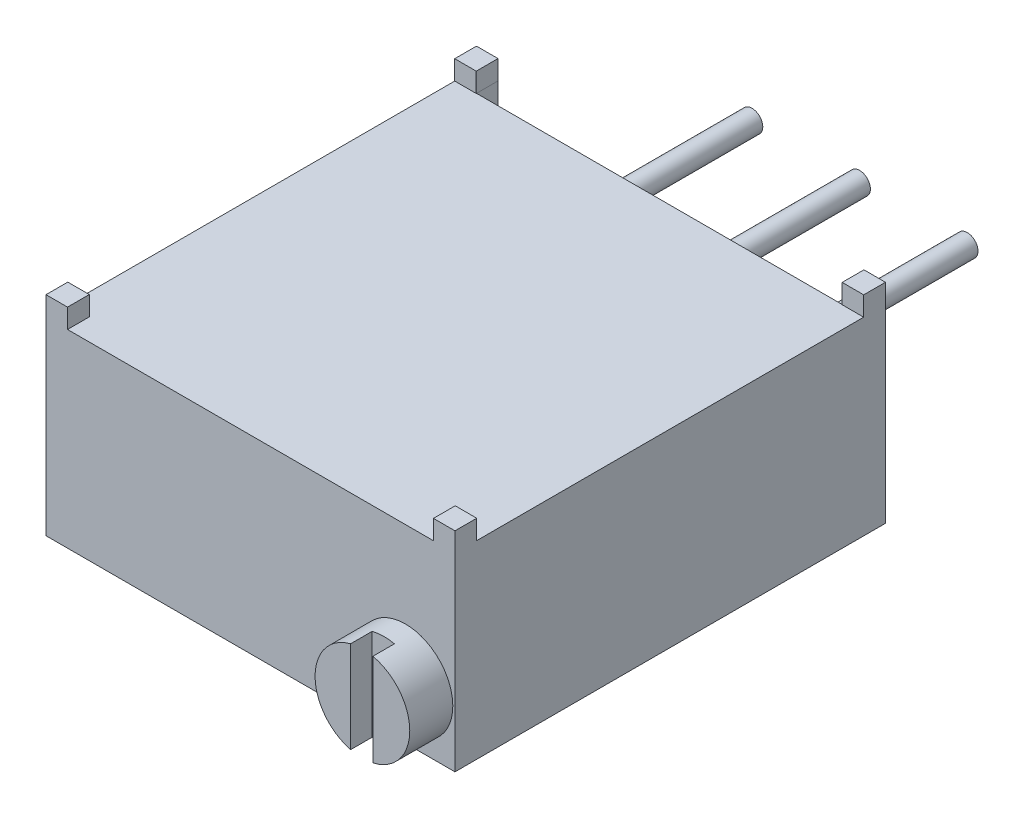
ISO-10303-21;
HEADER;
FILE_DESCRIPTION(('STEP AP214'),'2;1');
FILE_NAME('part.step','',(''),(''),'','','');
FILE_SCHEMA(('AUTOMOTIVE_DESIGN { 1 0 10303 214 1 1 1 1 }'));
ENDSEC;
DATA;
#1=APPLICATION_CONTEXT('core data for automotive mechanical design processes');
#2=APPLICATION_PROTOCOL_DEFINITION('international standard','automotive_design',2000,#1);
#3=PRODUCT_CONTEXT('',#1,'mechanical');
#4=PRODUCT('Part','Part','',(#3));
#5=PRODUCT_RELATED_PRODUCT_CATEGORY('part','',(#4));
#6=PRODUCT_DEFINITION_FORMATION('','',#4);
#7=PRODUCT_DEFINITION_CONTEXT('part definition',#1,'design');
#8=PRODUCT_DEFINITION('design','',#6,#7);
#9=PRODUCT_DEFINITION_SHAPE('','',#8);
#10=(LENGTH_UNIT() NAMED_UNIT(*) SI_UNIT(.MILLI.,.METRE.));
#11=(NAMED_UNIT(*) PLANE_ANGLE_UNIT() SI_UNIT($,.RADIAN.));
#12=(NAMED_UNIT(*) SI_UNIT($,.STERADIAN.) SOLID_ANGLE_UNIT());
#13=UNCERTAINTY_MEASURE_WITH_UNIT(LENGTH_MEASURE(1.E-05),#10,'distance_accuracy_value','');
#14=(GEOMETRIC_REPRESENTATION_CONTEXT(3) GLOBAL_UNCERTAINTY_ASSIGNED_CONTEXT((#13)) GLOBAL_UNIT_ASSIGNED_CONTEXT((#10,
#11,#12)) REPRESENTATION_CONTEXT('',''));
#15=CARTESIAN_POINT('',(0.,0.,0.));
#16=DIRECTION('',(0.,0.,1.));
#17=DIRECTION('',(1.,0.,0.));
#18=AXIS2_PLACEMENT_3D('',#15,#16,#17);
#19=CARTESIAN_POINT('',(-4.75,2.425,0.));
#20=DIRECTION('',(0.,1.,0.));
#21=DIRECTION('',(1.,0.,0.));
#22=AXIS2_PLACEMENT_3D('',#19,#20,#21);
#23=PLANE('',#22);
#24=DIRECTION('',(0.,0.,1.));
#25=VECTOR('',#24,1.);
#26=CARTESIAN_POINT('',(4.25,2.425,0.));
#27=LINE('',#26,#25);
#28=CARTESIAN_POINT('',(4.25,2.425,0.));
#29=VERTEX_POINT('',#28);
#30=CARTESIAN_POINT('',(4.25,2.425,0.5));
#31=VERTEX_POINT('',#30);
#32=EDGE_CURVE('P0_E11',#29,#31,#27,.T.);
#33=ORIENTED_EDGE('',*,*,#32,.T.);
#34=DIRECTION('',(0.,0.,-1.));
#35=VECTOR('',#34,1.);
#36=CARTESIAN_POINT('',(4.25,2.425,0.505806));
#37=LINE('',#36,#35);
#38=CARTESIAN_POINT('',(4.25,2.425,0.505806));
#39=VERTEX_POINT('',#38);
#40=EDGE_CURVE('P0_E28',#39,#31,#37,.T.);
#41=ORIENTED_EDGE('',*,*,#40,.F.);
#42=DIRECTION('',(-1.,0.,0.));
#43=VECTOR('',#42,1.);
#44=CARTESIAN_POINT('',(5.094449999992,2.425,0.505806));
#45=LINE('',#44,#43);
#46=CARTESIAN_POINT('',(4.75,2.425,0.505806));
#47=VERTEX_POINT('',#46);
#48=EDGE_CURVE('P0_E21',#47,#39,#45,.T.);
#49=ORIENTED_EDGE('',*,*,#48,.F.);
#50=DIRECTION('',(0.,0.,1.));
#51=VECTOR('',#50,1.);
#52=CARTESIAN_POINT('',(4.75,2.425,0.));
#53=LINE('',#52,#51);
#54=CARTESIAN_POINT('',(4.75,2.425,0.));
#55=VERTEX_POINT('',#54);
#56=EDGE_CURVE('P0_E411',#55,#47,#53,.T.);
#57=ORIENTED_EDGE('',*,*,#56,.F.);
#58=DIRECTION('',(1.,0.,0.));
#59=VECTOR('',#58,1.);
#60=CARTESIAN_POINT('',(-4.75,2.425,0.));
#61=LINE('',#60,#59);
#62=EDGE_CURVE('P0_E351',#29,#55,#61,.T.);
#63=ORIENTED_EDGE('',*,*,#62,.F.);
#64=EDGE_LOOP('',(#33,#41,#49,#57,#63));
#65=FACE_BOUND('',#64,.T.);
#66=ADVANCED_FACE('P0_F17',(#65),#23,.T.);
#67=CARTESIAN_POINT('',(4.25,-2.425,0.));
#68=DIRECTION('',(-1.,0.,0.));
#69=DIRECTION('',(0.,0.,1.));
#70=AXIS2_PLACEMENT_3D('',#67,#68,#69);
#71=PLANE('',#70);
#72=DIRECTION('',(0.,1.,0.));
#73=VECTOR('',#72,1.);
#74=CARTESIAN_POINT('',(4.25,-2.425,0.));
#75=LINE('',#74,#73);
#76=CARTESIAN_POINT('',(4.25,1.975,0.));
#77=VERTEX_POINT('',#76);
#78=EDGE_CURVE('P0_E314',#77,#29,#75,.T.);
#79=ORIENTED_EDGE('',*,*,#78,.F.);
#80=DIRECTION('',(0.,0.,-1.));
#81=VECTOR('',#80,1.);
#82=CARTESIAN_POINT('',(4.25,1.975,0.505806));
#83=LINE('',#82,#81);
#84=CARTESIAN_POINT('',(4.25,1.975,0.5));
#85=VERTEX_POINT('',#84);
#86=EDGE_CURVE('P0_E400',#85,#77,#83,.T.);
#87=ORIENTED_EDGE('',*,*,#86,.F.);
#88=DIRECTION('',(0.,1.,0.));
#89=VECTOR('',#88,1.);
#90=CARTESIAN_POINT('',(4.25,-2.425,0.5));
#91=LINE('',#90,#89);
#92=EDGE_CURVE('P0_E358',#85,#31,#91,.T.);
#93=ORIENTED_EDGE('',*,*,#92,.T.);
#94=ORIENTED_EDGE('',*,*,#32,.F.);
#95=EDGE_LOOP('',(#79,#87,#93,#94));
#96=FACE_BOUND('',#95,.T.);
#97=ADVANCED_FACE('P0_F686',(#96),#71,.T.);
#98=CARTESIAN_POINT('',(-4.75,2.425,0.));
#99=DIRECTION('',(0.,1.,0.));
#100=DIRECTION('',(1.,0.,0.));
#101=AXIS2_PLACEMENT_3D('',#98,#99,#100);
#102=PLANE('',#101);
#103=DIRECTION('',(0.,0.,-1.));
#104=VECTOR('',#103,1.);
#105=CARTESIAN_POINT('',(4.25,2.425,10.));
#106=LINE('',#105,#104);
#107=CARTESIAN_POINT('',(4.25,2.425,10.));
#108=VERTEX_POINT('',#107);
#109=CARTESIAN_POINT('',(4.25,2.425,9.494194));
#110=VERTEX_POINT('',#109);
#111=EDGE_CURVE('P0_E304',#108,#110,#106,.T.);
#112=ORIENTED_EDGE('',*,*,#111,.F.);
#113=DIRECTION('',(1.,0.,0.));
#114=VECTOR('',#113,1.);
#115=CARTESIAN_POINT('',(-4.75,2.425,10.));
#116=LINE('',#115,#114);
#117=CARTESIAN_POINT('',(4.75,2.425,10.));
#118=VERTEX_POINT('',#117);
#119=EDGE_CURVE('P0_E271',#108,#118,#116,.T.);
#120=ORIENTED_EDGE('',*,*,#119,.T.);
#121=DIRECTION('',(0.,0.,1.));
#122=VECTOR('',#121,1.);
#123=CARTESIAN_POINT('',(4.75,2.425,0.));
#124=LINE('',#123,#122);
#125=CARTESIAN_POINT('',(4.75,2.425,9.494194));
#126=VERTEX_POINT('',#125);
#127=EDGE_CURVE('P0_E308',#126,#118,#124,.T.);
#128=ORIENTED_EDGE('',*,*,#127,.F.);
#129=DIRECTION('',(1.,0.,0.));
#130=VECTOR('',#129,1.);
#131=CARTESIAN_POINT('',(4.25,2.425,9.494194));
#132=LINE('',#131,#130);
#133=EDGE_CURVE('P0_E363',#110,#126,#132,.T.);
#134=ORIENTED_EDGE('',*,*,#133,.F.);
#135=EDGE_LOOP('',(#112,#120,#128,#134));
#136=FACE_BOUND('',#135,.T.);
#137=ADVANCED_FACE('P0_F691',(#136),#102,.T.);
#138=CARTESIAN_POINT('',(-4.25,2.425,10.));
#139=DIRECTION('',(1.,0.,0.));
#140=DIRECTION('',(0.,1.,0.));
#141=AXIS2_PLACEMENT_3D('',#138,#139,#140);
#142=PLANE('',#141);
#143=DIRECTION('',(0.,-1.,0.));
#144=VECTOR('',#143,1.);
#145=CARTESIAN_POINT('',(-4.25,2.425,10.));
#146=LINE('',#145,#144);
#147=CARTESIAN_POINT('',(-4.25,2.425,10.));
#148=VERTEX_POINT('',#147);
#149=CARTESIAN_POINT('',(-4.25,1.975,10.));
#150=VERTEX_POINT('',#149);
#151=EDGE_CURVE('P0_E212',#148,#150,#146,.T.);
#152=ORIENTED_EDGE('',*,*,#151,.T.);
#153=DIRECTION('',(0.,0.,-1.));
#154=VECTOR('',#153,1.);
#155=CARTESIAN_POINT('',(-4.25,1.975,10.));
#156=LINE('',#155,#154);
#157=CARTESIAN_POINT('',(-4.25,1.975,9.494194));
#158=VERTEX_POINT('',#157);
#159=EDGE_CURVE('P0_E210',#150,#158,#156,.T.);
#160=ORIENTED_EDGE('',*,*,#159,.T.);
#161=DIRECTION('',(0.,-1.,0.));
#162=VECTOR('',#161,1.);
#163=CARTESIAN_POINT('',(-4.25,2.425,9.494194));
#164=LINE('',#163,#162);
#165=CARTESIAN_POINT('',(-4.25,2.425,9.494194));
#166=VERTEX_POINT('',#165);
#167=EDGE_CURVE('P0_E196',#166,#158,#164,.T.);
#168=ORIENTED_EDGE('',*,*,#167,.F.);
#169=DIRECTION('',(0.,0.,-1.));
#170=VECTOR('',#169,1.);
#171=CARTESIAN_POINT('',(-4.25,2.425,10.));
#172=LINE('',#171,#170);
#173=EDGE_CURVE('P0_E266',#148,#166,#172,.T.);
#174=ORIENTED_EDGE('',*,*,#173,.F.);
#175=EDGE_LOOP('',(#152,#160,#168,#174));
#176=FACE_BOUND('',#175,.T.);
#177=ADVANCED_FACE('P0_F211',(#176),#142,.T.);
#178=CARTESIAN_POINT('',(4.25,2.425,0.505806));
#179=DIRECTION('',(1.,0.,0.));
#180=DIRECTION('',(0.,1.,0.));
#181=AXIS2_PLACEMENT_3D('',#178,#179,#180);
#182=PLANE('',#181);
#183=ORIENTED_EDGE('',*,*,#92,.F.);
#184=DIRECTION('',(0.,0.,-1.));
#185=VECTOR('',#184,1.);
#186=CARTESIAN_POINT('',(4.25,1.975,0.505806));
#187=LINE('',#186,#185);
#188=CARTESIAN_POINT('',(4.25,1.975,0.505806));
#189=VERTEX_POINT('',#188);
#190=EDGE_CURVE('P0_E232',#189,#85,#187,.T.);
#191=ORIENTED_EDGE('',*,*,#190,.F.);
#192=DIRECTION('',(0.,-1.,0.));
#193=VECTOR('',#192,1.);
#194=CARTESIAN_POINT('',(4.25,2.425,0.505806));
#195=LINE('',#194,#193);
#196=EDGE_CURVE('P0_E367',#39,#189,#195,.T.);
#197=ORIENTED_EDGE('',*,*,#196,.F.);
#198=ORIENTED_EDGE('',*,*,#40,.T.);
#199=EDGE_LOOP('',(#183,#191,#197,#198));
#200=FACE_BOUND('',#199,.T.);
#201=ADVANCED_FACE('P0_F670',(#200),#182,.F.);
#202=CARTESIAN_POINT('',(5.094449999992,2.425,0.505806));
#203=DIRECTION('',(0.,0.,-1.));
#204=DIRECTION('',(0.,-1.,0.));
#205=AXIS2_PLACEMENT_3D('',#202,#203,#204);
#206=PLANE('',#205);
#207=ORIENTED_EDGE('',*,*,#196,.T.);
#208=DIRECTION('',(-1.,0.,0.));
#209=VECTOR('',#208,1.);
#210=CARTESIAN_POINT('',(5.094449999992,1.975,0.505806));
#211=LINE('',#210,#209);
#212=CARTESIAN_POINT('',(4.75,1.975,0.505806));
#213=VERTEX_POINT('',#212);
#214=EDGE_CURVE('P0_E237',#213,#189,#211,.T.);
#215=ORIENTED_EDGE('',*,*,#214,.F.);
#216=DIRECTION('',(0.,1.,0.));
#217=VECTOR('',#216,1.);
#218=CARTESIAN_POINT('',(4.75,2.425,0.505806));
#219=LINE('',#218,#217);
#220=EDGE_CURVE('P0_E415',#213,#47,#219,.T.);
#221=ORIENTED_EDGE('',*,*,#220,.T.);
#222=ORIENTED_EDGE('',*,*,#48,.T.);
#223=EDGE_LOOP('',(#207,#215,#221,#222));
#224=FACE_BOUND('',#223,.T.);
#225=ADVANCED_FACE('P0_F624',(#224),#206,.F.);
#226=CARTESIAN_POINT('',(4.25,2.425,9.494194));
#227=DIRECTION('',(0.,0.,1.));
#228=DIRECTION('',(0.,-1.,0.));
#229=AXIS2_PLACEMENT_3D('',#226,#227,#228);
#230=PLANE('',#229);
#231=DIRECTION('',(0.,-1.,0.));
#232=VECTOR('',#231,1.);
#233=CARTESIAN_POINT('',(4.75,2.425,9.494194));
#234=LINE('',#233,#232);
#235=CARTESIAN_POINT('',(4.75,1.975,9.494194));
#236=VERTEX_POINT('',#235);
#237=EDGE_CURVE('P0_E235',#126,#236,#234,.T.);
#238=ORIENTED_EDGE('',*,*,#237,.T.);
#239=DIRECTION('',(1.,0.,0.));
#240=VECTOR('',#239,1.);
#241=CARTESIAN_POINT('',(4.25,1.975,9.494194));
#242=LINE('',#241,#240);
#243=CARTESIAN_POINT('',(4.25,1.975,9.494194));
#244=VERTEX_POINT('',#243);
#245=EDGE_CURVE('P0_E249',#244,#236,#242,.T.);
#246=ORIENTED_EDGE('',*,*,#245,.F.);
#247=DIRECTION('',(0.,-1.,0.));
#248=VECTOR('',#247,1.);
#249=CARTESIAN_POINT('',(4.25,2.425,9.494194));
#250=LINE('',#249,#248);
#251=EDGE_CURVE('P0_E307',#110,#244,#250,.T.);
#252=ORIENTED_EDGE('',*,*,#251,.F.);
#253=ORIENTED_EDGE('',*,*,#133,.T.);
#254=EDGE_LOOP('',(#238,#246,#252,#253));
#255=FACE_BOUND('',#254,.T.);
#256=ADVANCED_FACE('P0_F618',(#255),#230,.F.);
#257=CARTESIAN_POINT('',(4.25,2.425,10.));
#258=DIRECTION('',(1.,0.,0.));
#259=DIRECTION('',(0.,1.,0.));
#260=AXIS2_PLACEMENT_3D('',#257,#258,#259);
#261=PLANE('',#260);
#262=ORIENTED_EDGE('',*,*,#111,.T.);
#263=ORIENTED_EDGE('',*,*,#251,.T.);
#264=DIRECTION('',(0.,0.,-1.));
#265=VECTOR('',#264,1.);
#266=CARTESIAN_POINT('',(4.25,1.975,10.));
#267=LINE('',#266,#265);
#268=CARTESIAN_POINT('',(4.25,1.975,10.));
#269=VERTEX_POINT('',#268);
#270=EDGE_CURVE('P0_E294',#269,#244,#267,.T.);
#271=ORIENTED_EDGE('',*,*,#270,.F.);
#272=DIRECTION('',(0.,-1.,0.));
#273=VECTOR('',#272,1.);
#274=CARTESIAN_POINT('',(4.25,2.425,10.));
#275=LINE('',#274,#273);
#276=EDGE_CURVE('P0_E280',#108,#269,#275,.T.);
#277=ORIENTED_EDGE('',*,*,#276,.F.);
#278=EDGE_LOOP('',(#262,#263,#271,#277));
#279=FACE_BOUND('',#278,.T.);
#280=ADVANCED_FACE('P0_F623',(#279),#261,.F.);
#281=CARTESIAN_POINT('',(4.75,2.425,0.));
#282=DIRECTION('',(1.,0.,0.));
#283=DIRECTION('',(0.,1.,0.));
#284=AXIS2_PLACEMENT_3D('',#281,#282,#283);
#285=PLANE('',#284);
#286=DIRECTION('',(0.,-1.,0.));
#287=VECTOR('',#286,1.);
#288=CARTESIAN_POINT('',(4.75,2.425,0.));
#289=LINE('',#288,#287);
#290=CARTESIAN_POINT('',(4.75,-2.425,0.));
#291=VERTEX_POINT('',#290);
#292=EDGE_CURVE('P0_E384',#55,#291,#289,.T.);
#293=ORIENTED_EDGE('',*,*,#292,.F.);
#294=ORIENTED_EDGE('',*,*,#56,.T.);
#295=ORIENTED_EDGE('',*,*,#220,.F.);
#296=DIRECTION('',(0.,0.,-1.));
#297=VECTOR('',#296,1.);
#298=CARTESIAN_POINT('',(4.75,1.975,2.5));
#299=LINE('',#298,#297);
#300=EDGE_CURVE('P0_E240',#236,#213,#299,.T.);
#301=ORIENTED_EDGE('',*,*,#300,.F.);
#302=ORIENTED_EDGE('',*,*,#237,.F.);
#303=ORIENTED_EDGE('',*,*,#127,.T.);
#304=DIRECTION('',(0.,-1.,0.));
#305=VECTOR('',#304,1.);
#306=CARTESIAN_POINT('',(4.75,2.425,10.));
#307=LINE('',#306,#305);
#308=CARTESIAN_POINT('',(4.75,-2.425,10.));
#309=VERTEX_POINT('',#308);
#310=EDGE_CURVE('P0_E269',#118,#309,#307,.T.);
#311=ORIENTED_EDGE('',*,*,#310,.T.);
#312=DIRECTION('',(0.,0.,1.));
#313=VECTOR('',#312,1.);
#314=CARTESIAN_POINT('',(4.75,-2.425,0.));
#315=LINE('',#314,#313);
#316=EDGE_CURVE('P0_E372',#291,#309,#315,.T.);
#317=ORIENTED_EDGE('',*,*,#316,.F.);
#318=EDGE_LOOP('',(#293,#294,#295,#301,#302,#303,#311,#317));
#319=FACE_BOUND('',#318,.T.);
#320=ADVANCED_FACE('P0_F762',(#319),#285,.T.);
#321=CARTESIAN_POINT('',(0.,0.,0.5));
#322=DIRECTION('',(0.,0.,1.));
#323=DIRECTION('',(1.,0.,0.));
#324=AXIS2_PLACEMENT_3D('',#321,#322,#323);
#325=PLANE('',#324);
#326=DIRECTION('',(1.,0.,0.));
#327=VECTOR('',#326,1.);
#328=CARTESIAN_POINT('',(0.,1.975,0.5));
#329=LINE('',#328,#327);
#330=CARTESIAN_POINT('',(-4.25,1.975,0.5));
#331=VERTEX_POINT('',#330);
#332=EDGE_CURVE('P0_E225',#331,#85,#329,.T.);
#333=ORIENTED_EDGE('',*,*,#332,.T.);
#334=DIRECTION('',(0.,1.,0.));
#335=VECTOR('',#334,1.);
#336=CARTESIAN_POINT('',(4.25,-2.425,0.5));
#337=LINE('',#336,#335);
#338=CARTESIAN_POINT('',(4.25,-2.425,0.5));
#339=VERTEX_POINT('',#338);
#340=EDGE_CURVE('P0_E387',#339,#85,#337,.T.);
#341=ORIENTED_EDGE('',*,*,#340,.F.);
#342=DIRECTION('',(1.,0.,0.));
#343=VECTOR('',#342,1.);
#344=CARTESIAN_POINT('',(-4.25,-2.425,0.5));
#345=LINE('',#344,#343);
#346=CARTESIAN_POINT('',(-4.25,-2.425,0.5));
#347=VERTEX_POINT('',#346);
#348=EDGE_CURVE('P0_E333',#347,#339,#345,.T.);
#349=ORIENTED_EDGE('',*,*,#348,.F.);
#350=DIRECTION('',(0.,-1.,0.));
#351=VECTOR('',#350,1.);
#352=CARTESIAN_POINT('',(-4.25,2.425,0.5));
#353=LINE('',#352,#351);
#354=EDGE_CURVE('P0_E255',#331,#347,#353,.T.);
#355=ORIENTED_EDGE('',*,*,#354,.F.);
#356=EDGE_LOOP('',(#333,#341,#349,#355));
#357=FACE_BOUND('',#356,.T.);
#358=ADVANCED_FACE('P0_F19',(#357),#325,.F.);
#359=CARTESIAN_POINT('',(4.25,-2.425,0.));
#360=DIRECTION('',(-1.,0.,0.));
#361=DIRECTION('',(0.,0.,1.));
#362=AXIS2_PLACEMENT_3D('',#359,#360,#361);
#363=PLANE('',#362);
#364=DIRECTION('',(0.,1.,0.));
#365=VECTOR('',#364,1.);
#366=CARTESIAN_POINT('',(4.25,-2.425,0.));
#367=LINE('',#366,#365);
#368=CARTESIAN_POINT('',(4.25,-2.425,0.));
#369=VERTEX_POINT('',#368);
#370=EDGE_CURVE('P0_E310',#369,#77,#367,.T.);
#371=ORIENTED_EDGE('',*,*,#370,.F.);
#372=DIRECTION('',(0.,0.,1.));
#373=VECTOR('',#372,1.);
#374=CARTESIAN_POINT('',(4.25,-2.425,0.));
#375=LINE('',#374,#373);
#376=EDGE_CURVE('P0_E329',#369,#339,#375,.T.);
#377=ORIENTED_EDGE('',*,*,#376,.T.);
#378=ORIENTED_EDGE('',*,*,#340,.T.);
#379=ORIENTED_EDGE('',*,*,#86,.T.);
#380=EDGE_LOOP('',(#371,#377,#378,#379));
#381=FACE_BOUND('',#380,.T.);
#382=ADVANCED_FACE('P0_F736',(#381),#363,.T.);
#383=CARTESIAN_POINT('',(0.,0.,0.));
#384=DIRECTION('',(0.,0.,-1.));
#385=DIRECTION('',(0.,-1.,0.));
#386=AXIS2_PLACEMENT_3D('',#383,#384,#385);
#387=PLANE('',#386);
#388=ORIENTED_EDGE('',*,*,#370,.T.);
#389=ORIENTED_EDGE('',*,*,#78,.T.);
#390=ORIENTED_EDGE('',*,*,#62,.T.);
#391=ORIENTED_EDGE('',*,*,#292,.T.);
#392=DIRECTION('',(-1.,0.,0.));
#393=VECTOR('',#392,1.);
#394=CARTESIAN_POINT('',(4.75,-2.425,0.));
#395=LINE('',#394,#393);
#396=EDGE_CURVE('P0_E368',#291,#369,#395,.T.);
#397=ORIENTED_EDGE('',*,*,#396,.T.);
#398=EDGE_LOOP('',(#388,#389,#390,#391,#397));
#399=FACE_BOUND('',#398,.T.);
#400=ADVANCED_FACE('P0_F663',(#399),#387,.T.);
#401=CARTESIAN_POINT('',(0.,0.,10.));
#402=DIRECTION('',(0.,0.,-1.));
#403=DIRECTION('',(0.,-1.,0.));
#404=AXIS2_PLACEMENT_3D('',#401,#402,#403);
#405=PLANE('',#404);
#406=DIRECTION('',(-1.,0.,0.));
#407=VECTOR('',#406,1.);
#408=CARTESIAN_POINT('',(4.75,-2.425,10.));
#409=LINE('',#408,#407);
#410=CARTESIAN_POINT('',(-4.75,-2.425,10.));
#411=VERTEX_POINT('',#410);
#412=EDGE_CURVE('P0_E348',#309,#411,#409,.T.);
#413=ORIENTED_EDGE('',*,*,#412,.F.);
#414=ORIENTED_EDGE('',*,*,#310,.F.);
#415=ORIENTED_EDGE('',*,*,#119,.F.);
#416=ORIENTED_EDGE('',*,*,#276,.T.);
#417=DIRECTION('',(-1.,0.,0.));
#418=VECTOR('',#417,1.);
#419=CARTESIAN_POINT('',(4.25,1.975,10.));
#420=LINE('',#419,#418);
#421=EDGE_CURVE('P0_E217',#269,#150,#420,.T.);
#422=ORIENTED_EDGE('',*,*,#421,.T.);
#423=ORIENTED_EDGE('',*,*,#151,.F.);
#424=DIRECTION('',(1.,0.,0.));
#425=VECTOR('',#424,1.);
#426=CARTESIAN_POINT('',(-4.75,2.425,10.));
#427=LINE('',#426,#425);
#428=CARTESIAN_POINT('',(-4.75,2.425,10.));
#429=VERTEX_POINT('',#428);
#430=EDGE_CURVE('P0_E207',#429,#148,#427,.T.);
#431=ORIENTED_EDGE('',*,*,#430,.F.);
#432=DIRECTION('',(0.,1.,0.));
#433=VECTOR('',#432,1.);
#434=CARTESIAN_POINT('',(-4.75,-2.425,10.));
#435=LINE('',#434,#433);
#436=EDGE_CURVE('P0_E340',#411,#429,#435,.T.);
#437=ORIENTED_EDGE('',*,*,#436,.F.);
#438=EDGE_LOOP('',(#413,#414,#415,#416,#422,#423,#431,#437));
#439=FACE_BOUND('',#438,.T.);
#440=ADVANCED_FACE('P0_F657',(#439),#405,.F.);
#441=CARTESIAN_POINT('',(-4.75,2.425,0.));
#442=DIRECTION('',(0.,1.,0.));
#443=DIRECTION('',(1.,0.,0.));
#444=AXIS2_PLACEMENT_3D('',#441,#442,#443);
#445=PLANE('',#444);
#446=DIRECTION('',(-1.,0.,0.));
#447=VECTOR('',#446,1.);
#448=CARTESIAN_POINT('',(-4.25,2.425,9.494194));
#449=LINE('',#448,#447);
#450=CARTESIAN_POINT('',(-4.75,2.425,9.494194));
#451=VERTEX_POINT('',#450);
#452=EDGE_CURVE('P0_E203',#166,#451,#449,.T.);
#453=ORIENTED_EDGE('',*,*,#452,.T.);
#454=DIRECTION('',(0.,0.,1.));
#455=VECTOR('',#454,1.);
#456=CARTESIAN_POINT('',(-4.75,2.425,0.));
#457=LINE('',#456,#455);
#458=EDGE_CURVE('P0_E344',#451,#429,#457,.T.);
#459=ORIENTED_EDGE('',*,*,#458,.T.);
#460=ORIENTED_EDGE('',*,*,#430,.T.);
#461=ORIENTED_EDGE('',*,*,#173,.T.);
#462=EDGE_LOOP('',(#453,#459,#460,#461));
#463=FACE_BOUND('',#462,.T.);
#464=ADVANCED_FACE('P0_F662',(#463),#445,.T.);
#465=CARTESIAN_POINT('',(-4.25,2.425,9.494194));
#466=DIRECTION('',(0.,0.,-1.));
#467=DIRECTION('',(0.,-1.,0.));
#468=AXIS2_PLACEMENT_3D('',#465,#466,#467);
#469=PLANE('',#468);
#470=ORIENTED_EDGE('',*,*,#452,.F.);
#471=ORIENTED_EDGE('',*,*,#167,.T.);
#472=DIRECTION('',(-1.,0.,0.));
#473=VECTOR('',#472,1.);
#474=CARTESIAN_POINT('',(-4.25,1.975,9.494194));
#475=LINE('',#474,#473);
#476=CARTESIAN_POINT('',(-4.75,1.975,9.494194));
#477=VERTEX_POINT('',#476);
#478=EDGE_CURVE('P0_E201',#158,#477,#475,.T.);
#479=ORIENTED_EDGE('',*,*,#478,.T.);
#480=DIRECTION('',(0.,-1.,0.));
#481=VECTOR('',#480,1.);
#482=CARTESIAN_POINT('',(-4.75,0.,9.494194));
#483=LINE('',#482,#481);
#484=EDGE_CURVE('P0_E362',#451,#477,#483,.T.);
#485=ORIENTED_EDGE('',*,*,#484,.F.);
#486=EDGE_LOOP('',(#470,#471,#479,#485));
#487=FACE_BOUND('',#486,.T.);
#488=ADVANCED_FACE('P0_F198',(#487),#469,.T.);
#489=CARTESIAN_POINT('',(0.,1.975,5.));
#490=DIRECTION('',(0.,-1.,0.));
#491=DIRECTION('',(-1.,0.,0.));
#492=AXIS2_PLACEMENT_3D('',#489,#490,#491);
#493=PLANE('',#492);
#494=ORIENTED_EDGE('',*,*,#245,.T.);
#495=ORIENTED_EDGE('',*,*,#300,.T.);
#496=ORIENTED_EDGE('',*,*,#214,.T.);
#497=ORIENTED_EDGE('',*,*,#190,.T.);
#498=ORIENTED_EDGE('',*,*,#332,.F.);
#499=DIRECTION('',(0.,0.,-1.));
#500=VECTOR('',#499,1.);
#501=CARTESIAN_POINT('',(-4.25,1.975,0.505806));
#502=LINE('',#501,#500);
#503=CARTESIAN_POINT('',(-4.25,1.975,0.505806));
#504=VERTEX_POINT('',#503);
#505=EDGE_CURVE('P0_E260',#504,#331,#502,.T.);
#506=ORIENTED_EDGE('',*,*,#505,.F.);
#507=DIRECTION('',(1.,0.,0.));
#508=VECTOR('',#507,1.);
#509=CARTESIAN_POINT('',(-5.094449999992,1.975,0.505806));
#510=LINE('',#509,#508);
#511=CARTESIAN_POINT('',(-4.75,1.975,0.505806));
#512=VERTEX_POINT('',#511);
#513=EDGE_CURVE('P0_E328',#512,#504,#510,.T.);
#514=ORIENTED_EDGE('',*,*,#513,.F.);
#515=DIRECTION('',(0.,0.,1.));
#516=VECTOR('',#515,1.);
#517=CARTESIAN_POINT('',(-4.75,1.975,2.5));
#518=LINE('',#517,#516);
#519=EDGE_CURVE('P0_E222',#512,#477,#518,.T.);
#520=ORIENTED_EDGE('',*,*,#519,.T.);
#521=ORIENTED_EDGE('',*,*,#478,.F.);
#522=ORIENTED_EDGE('',*,*,#159,.F.);
#523=ORIENTED_EDGE('',*,*,#421,.F.);
#524=ORIENTED_EDGE('',*,*,#270,.T.);
#525=EDGE_LOOP('',(#494,#495,#496,#497,#498,#506,#514,#520,#521,#522,#523,#524));
#526=FACE_BOUND('',#525,.T.);
#527=ADVANCED_FACE('P0_F220',(#526),#493,.F.);
#528=CARTESIAN_POINT('',(-4.25,2.425,0.));
#529=DIRECTION('',(1.,0.,0.));
#530=DIRECTION('',(0.,1.,0.));
#531=AXIS2_PLACEMENT_3D('',#528,#529,#530);
#532=PLANE('',#531);
#533=DIRECTION('',(0.,-1.,0.));
#534=VECTOR('',#533,1.);
#535=CARTESIAN_POINT('',(-4.25,2.425,0.));
#536=LINE('',#535,#534);
#537=CARTESIAN_POINT('',(-4.25,1.975,0.));
#538=VERTEX_POINT('',#537);
#539=CARTESIAN_POINT('',(-4.25,-2.425,0.));
#540=VERTEX_POINT('',#539);
#541=EDGE_CURVE('P0_E380',#538,#540,#536,.T.);
#542=ORIENTED_EDGE('',*,*,#541,.F.);
#543=DIRECTION('',(0.,0.,-1.));
#544=VECTOR('',#543,1.);
#545=CARTESIAN_POINT('',(-4.25,1.975,0.505806));
#546=LINE('',#545,#544);
#547=EDGE_CURVE('P0_E142',#331,#538,#546,.T.);
#548=ORIENTED_EDGE('',*,*,#547,.F.);
#549=ORIENTED_EDGE('',*,*,#354,.T.);
#550=DIRECTION('',(0.,0.,1.));
#551=VECTOR('',#550,1.);
#552=CARTESIAN_POINT('',(-4.25,-2.425,0.));
#553=LINE('',#552,#551);
#554=EDGE_CURVE('P0_E130',#540,#347,#553,.T.);
#555=ORIENTED_EDGE('',*,*,#554,.F.);
#556=EDGE_LOOP('',(#542,#548,#549,#555));
#557=FACE_BOUND('',#556,.T.);
#558=ADVANCED_FACE('P0_F462',(#557),#532,.T.);
#559=CARTESIAN_POINT('',(4.75,-2.425,0.));
#560=DIRECTION('',(0.,-1.,0.));
#561=DIRECTION('',(0.,0.,-1.));
#562=AXIS2_PLACEMENT_3D('',#559,#560,#561);
#563=PLANE('',#562);
#564=ORIENTED_EDGE('',*,*,#396,.F.);
#565=ORIENTED_EDGE('',*,*,#316,.T.);
#566=ORIENTED_EDGE('',*,*,#412,.T.);
#567=DIRECTION('',(0.,0.,1.));
#568=VECTOR('',#567,1.);
#569=CARTESIAN_POINT('',(-4.75,-2.425,0.));
#570=LINE('',#569,#568);
#571=CARTESIAN_POINT('',(-4.75,-2.425,0.));
#572=VERTEX_POINT('',#571);
#573=EDGE_CURVE('P0_E345',#572,#411,#570,.T.);
#574=ORIENTED_EDGE('',*,*,#573,.F.);
#575=DIRECTION('',(-1.,0.,0.));
#576=VECTOR('',#575,1.);
#577=CARTESIAN_POINT('',(4.75,-2.425,0.));
#578=LINE('',#577,#576);
#579=EDGE_CURVE('P0_E374',#540,#572,#578,.T.);
#580=ORIENTED_EDGE('',*,*,#579,.F.);
#581=ORIENTED_EDGE('',*,*,#554,.T.);
#582=ORIENTED_EDGE('',*,*,#348,.T.);
#583=ORIENTED_EDGE('',*,*,#376,.F.);
#584=EDGE_LOOP('',(#564,#565,#566,#574,#580,#581,#582,#583));
#585=FACE_BOUND('',#584,.T.);
#586=ADVANCED_FACE('P0_F459',(#585),#563,.T.);
#587=CARTESIAN_POINT('',(-4.75,-2.425,0.));
#588=DIRECTION('',(-1.,0.,0.));
#589=DIRECTION('',(0.,0.,1.));
#590=AXIS2_PLACEMENT_3D('',#587,#588,#589);
#591=PLANE('',#590);
#592=DIRECTION('',(0.,1.,0.));
#593=VECTOR('',#592,1.);
#594=CARTESIAN_POINT('',(-4.75,-2.425,0.));
#595=LINE('',#594,#593);
#596=CARTESIAN_POINT('',(-4.75,2.425,0.));
#597=VERTEX_POINT('',#596);
#598=EDGE_CURVE('P0_E381',#572,#597,#595,.T.);
#599=ORIENTED_EDGE('',*,*,#598,.F.);
#600=ORIENTED_EDGE('',*,*,#573,.T.);
#601=ORIENTED_EDGE('',*,*,#436,.T.);
#602=ORIENTED_EDGE('',*,*,#458,.F.);
#603=ORIENTED_EDGE('',*,*,#484,.T.);
#604=ORIENTED_EDGE('',*,*,#519,.F.);
#605=DIRECTION('',(0.,1.,0.));
#606=VECTOR('',#605,1.);
#607=CARTESIAN_POINT('',(-4.75,0.,0.505806));
#608=LINE('',#607,#606);
#609=CARTESIAN_POINT('',(-4.75,2.425,0.505806));
#610=VERTEX_POINT('',#609);
#611=EDGE_CURVE('P0_E264',#512,#610,#608,.T.);
#612=ORIENTED_EDGE('',*,*,#611,.T.);
#613=DIRECTION('',(0.,0.,1.));
#614=VECTOR('',#613,1.);
#615=CARTESIAN_POINT('',(-4.75,2.425,0.));
#616=LINE('',#615,#614);
#617=EDGE_CURVE('P0_E299',#597,#610,#616,.T.);
#618=ORIENTED_EDGE('',*,*,#617,.F.);
#619=EDGE_LOOP('',(#599,#600,#601,#602,#603,#604,#612,#618));
#620=FACE_BOUND('',#619,.T.);
#621=ADVANCED_FACE('P0_F456',(#620),#591,.T.);
#622=CARTESIAN_POINT('',(-5.094449999992,2.425,0.505806));
#623=DIRECTION('',(0.,0.,1.));
#624=DIRECTION('',(0.,-1.,0.));
#625=AXIS2_PLACEMENT_3D('',#622,#623,#624);
#626=PLANE('',#625);
#627=DIRECTION('',(1.,0.,0.));
#628=VECTOR('',#627,1.);
#629=CARTESIAN_POINT('',(-5.094449999992,2.425,0.505806));
#630=LINE('',#629,#628);
#631=CARTESIAN_POINT('',(-4.25,2.425,0.505806));
#632=VERTEX_POINT('',#631);
#633=EDGE_CURVE('P0_E295',#610,#632,#630,.T.);
#634=ORIENTED_EDGE('',*,*,#633,.F.);
#635=ORIENTED_EDGE('',*,*,#611,.F.);
#636=ORIENTED_EDGE('',*,*,#513,.T.);
#637=DIRECTION('',(0.,-1.,0.));
#638=VECTOR('',#637,1.);
#639=CARTESIAN_POINT('',(-4.25,2.425,0.505806));
#640=LINE('',#639,#638);
#641=EDGE_CURVE('P0_E265',#632,#504,#640,.T.);
#642=ORIENTED_EDGE('',*,*,#641,.F.);
#643=EDGE_LOOP('',(#634,#635,#636,#642));
#644=FACE_BOUND('',#643,.T.);
#645=ADVANCED_FACE('P0_F612',(#644),#626,.T.);
#646=CARTESIAN_POINT('',(-4.25,2.425,0.505806));
#647=DIRECTION('',(1.,0.,0.));
#648=DIRECTION('',(0.,1.,0.));
#649=AXIS2_PLACEMENT_3D('',#646,#647,#648);
#650=PLANE('',#649);
#651=DIRECTION('',(0.,0.,-1.));
#652=VECTOR('',#651,1.);
#653=CARTESIAN_POINT('',(-4.25,2.425,0.505806));
#654=LINE('',#653,#652);
#655=CARTESIAN_POINT('',(-4.25,2.425,0.5));
#656=VERTEX_POINT('',#655);
#657=EDGE_CURVE('P0_E298',#632,#656,#654,.T.);
#658=ORIENTED_EDGE('',*,*,#657,.F.);
#659=ORIENTED_EDGE('',*,*,#641,.T.);
#660=ORIENTED_EDGE('',*,*,#505,.T.);
#661=DIRECTION('',(0.,-1.,0.));
#662=VECTOR('',#661,1.);
#663=CARTESIAN_POINT('',(-4.25,2.425,0.5));
#664=LINE('',#663,#662);
#665=EDGE_CURVE('P0_E339',#656,#331,#664,.T.);
#666=ORIENTED_EDGE('',*,*,#665,.F.);
#667=EDGE_LOOP('',(#658,#659,#660,#666));
#668=FACE_BOUND('',#667,.T.);
#669=ADVANCED_FACE('P0_F469',(#668),#650,.T.);
#670=CARTESIAN_POINT('',(-4.25,2.425,0.));
#671=DIRECTION('',(1.,0.,0.));
#672=DIRECTION('',(0.,1.,0.));
#673=AXIS2_PLACEMENT_3D('',#670,#671,#672);
#674=PLANE('',#673);
#675=DIRECTION('',(0.,-1.,0.));
#676=VECTOR('',#675,1.);
#677=CARTESIAN_POINT('',(-4.25,2.425,0.));
#678=LINE('',#677,#676);
#679=CARTESIAN_POINT('',(-4.25,2.425,0.));
#680=VERTEX_POINT('',#679);
#681=EDGE_CURVE('P0_E376',#680,#538,#678,.T.);
#682=ORIENTED_EDGE('',*,*,#681,.F.);
#683=DIRECTION('',(0.,0.,1.));
#684=VECTOR('',#683,1.);
#685=CARTESIAN_POINT('',(-4.25,2.425,0.));
#686=LINE('',#685,#684);
#687=EDGE_CURVE('P0_E318',#680,#656,#686,.T.);
#688=ORIENTED_EDGE('',*,*,#687,.T.);
#689=ORIENTED_EDGE('',*,*,#665,.T.);
#690=ORIENTED_EDGE('',*,*,#547,.T.);
#691=EDGE_LOOP('',(#682,#688,#689,#690));
#692=FACE_BOUND('',#691,.T.);
#693=ADVANCED_FACE('P0_F465',(#692),#674,.T.);
#694=CARTESIAN_POINT('',(0.,0.,0.));
#695=DIRECTION('',(0.,0.,-1.));
#696=DIRECTION('',(0.,-1.,0.));
#697=AXIS2_PLACEMENT_3D('',#694,#695,#696);
#698=PLANE('',#697);
#699=ORIENTED_EDGE('',*,*,#598,.T.);
#700=DIRECTION('',(1.,0.,0.));
#701=VECTOR('',#700,1.);
#702=CARTESIAN_POINT('',(-4.75,2.425,0.));
#703=LINE('',#702,#701);
#704=EDGE_CURVE('P0_E319',#597,#680,#703,.T.);
#705=ORIENTED_EDGE('',*,*,#704,.T.);
#706=ORIENTED_EDGE('',*,*,#681,.T.);
#707=ORIENTED_EDGE('',*,*,#541,.T.);
#708=ORIENTED_EDGE('',*,*,#579,.T.);
#709=EDGE_LOOP('',(#699,#705,#706,#707,#708));
#710=FACE_BOUND('',#709,.T.);
#711=ADVANCED_FACE('P0_F461',(#710),#698,.T.);
#712=CARTESIAN_POINT('',(-4.75,2.425,0.));
#713=DIRECTION('',(0.,1.,0.));
#714=DIRECTION('',(1.,0.,0.));
#715=AXIS2_PLACEMENT_3D('',#712,#713,#714);
#716=PLANE('',#715);
#717=ORIENTED_EDGE('',*,*,#704,.F.);
#718=ORIENTED_EDGE('',*,*,#617,.T.);
#719=ORIENTED_EDGE('',*,*,#633,.T.);
#720=ORIENTED_EDGE('',*,*,#657,.T.);
#721=ORIENTED_EDGE('',*,*,#687,.F.);
#722=EDGE_LOOP('',(#717,#718,#719,#720,#721));
#723=FACE_BOUND('',#722,.T.);
#724=ADVANCED_FACE('P0_F635',(#723),#716,.T.);
#725=CLOSED_SHELL('',(#66,#97,#137,#177,#201,#225,#256,#280,#320,#358,#382,#400,#440,#464,#488,
#527,#558,#586,#621,#645,#669,#693,#711,#724));
#726=MANIFOLD_SOLID_BREP('P0_B1',#725);
#727=CARTESIAN_POINT('',(2.5,-0.025,-4.15));
#728=DIRECTION('',(0.,0.,-1.));
#729=DIRECTION('',(-1.,0.,0.));
#730=AXIS2_PLACEMENT_3D('',#727,#728,#729);
#731=PLANE('',#730);
#732=CARTESIAN_POINT('',(2.5,-0.025,-4.15));
#733=DIRECTION('',(0.,0.,-1.));
#734=DIRECTION('',(-1.,0.,0.));
#735=AXIS2_PLACEMENT_3D('',#732,#733,#734);
#736=CIRCLE('',#735,0.25);
#737=CARTESIAN_POINT('',(2.25,-0.025,-4.15));
#738=VERTEX_POINT('',#737);
#739=EDGE_CURVE('P1_E10',#738,#738,#736,.T.);
#740=ORIENTED_EDGE('',*,*,#739,.T.);
#741=EDGE_LOOP('',(#740));
#742=FACE_BOUND('',#741,.T.);
#743=ADVANCED_FACE('P1_F16',(#742),#731,.T.);
#744=CARTESIAN_POINT('',(0.,-0.025,-4.15));
#745=DIRECTION('',(0.,0.,-1.));
#746=DIRECTION('',(-1.,0.,0.));
#747=AXIS2_PLACEMENT_3D('',#744,#745,#746);
#748=PLANE('',#747);
#749=CARTESIAN_POINT('',(0.,-0.025,-4.15));
#750=DIRECTION('',(0.,0.,-1.));
#751=DIRECTION('',(-1.,0.,0.));
#752=AXIS2_PLACEMENT_3D('',#749,#750,#751);
#753=CIRCLE('',#752,0.25);
#754=CARTESIAN_POINT('',(-0.25,-0.025,-4.15));
#755=VERTEX_POINT('',#754);
#756=EDGE_CURVE('P1_E45',#755,#755,#753,.T.);
#757=ORIENTED_EDGE('',*,*,#756,.T.);
#758=EDGE_LOOP('',(#757));
#759=FACE_BOUND('',#758,.T.);
#760=ADVANCED_FACE('P1_F199',(#759),#748,.T.);
#761=CARTESIAN_POINT('',(-2.5,-0.025,-4.15));
#762=DIRECTION('',(0.,0.,-1.));
#763=DIRECTION('',(-1.,0.,0.));
#764=AXIS2_PLACEMENT_3D('',#761,#762,#763);
#765=PLANE('',#764);
#766=CARTESIAN_POINT('',(-2.5,-0.025,-4.15));
#767=DIRECTION('',(0.,0.,-1.));
#768=DIRECTION('',(-1.,0.,0.));
#769=AXIS2_PLACEMENT_3D('',#766,#767,#768);
#770=CIRCLE('',#769,0.25);
#771=CARTESIAN_POINT('',(-2.75,-0.025,-4.15));
#772=VERTEX_POINT('',#771);
#773=EDGE_CURVE('P1_E155',#772,#772,#770,.T.);
#774=ORIENTED_EDGE('',*,*,#773,.T.);
#775=EDGE_LOOP('',(#774));
#776=FACE_BOUND('',#775,.T.);
#777=ADVANCED_FACE('P1_F204',(#776),#765,.T.);
#778=CARTESIAN_POINT('',(2.5,-0.025,0.65));
#779=DIRECTION('',(0.,0.,1.));
#780=DIRECTION('',(-1.,0.,0.));
#781=AXIS2_PLACEMENT_3D('',#778,#779,#780);
#782=CYLINDRICAL_SURFACE('',#781,0.25);
#783=CARTESIAN_POINT('',(2.5,-0.025,0.65));
#784=DIRECTION('',(0.,0.,-1.));
#785=DIRECTION('',(-1.,0.,0.));
#786=AXIS2_PLACEMENT_3D('',#783,#784,#785);
#787=CIRCLE('',#786,0.25);
#788=CARTESIAN_POINT('',(2.25,-0.025,0.65));
#789=VERTEX_POINT('',#788);
#790=EDGE_CURVE('P1_E158',#789,#789,#787,.T.);
#791=ORIENTED_EDGE('',*,*,#790,.T.);
#792=DIRECTION('',(0.,0.,-1.));
#793=VECTOR('',#792,1.);
#794=CARTESIAN_POINT('',(2.25,-0.025,0.65));
#795=LINE('',#794,#793);
#796=EDGE_CURVE('P1_E26',#789,#738,#795,.T.);
#797=ORIENTED_EDGE('',*,*,#796,.T.);
#798=ORIENTED_EDGE('',*,*,#739,.F.);
#799=ORIENTED_EDGE('',*,*,#796,.F.);
#800=EDGE_LOOP('',(#791,#797,#798,#799));
#801=FACE_BOUND('',#800,.T.);
#802=ADVANCED_FACE('P1_F209',(#801),#782,.T.);
#803=CARTESIAN_POINT('',(0.,-0.025,0.65));
#804=DIRECTION('',(0.,0.,1.));
#805=DIRECTION('',(-1.,0.,0.));
#806=AXIS2_PLACEMENT_3D('',#803,#804,#805);
#807=CYLINDRICAL_SURFACE('',#806,0.25);
#808=CARTESIAN_POINT('',(0.,-0.025,0.65));
#809=DIRECTION('',(0.,0.,-1.));
#810=DIRECTION('',(-1.,0.,0.));
#811=AXIS2_PLACEMENT_3D('',#808,#809,#810);
#812=CIRCLE('',#811,0.25);
#813=CARTESIAN_POINT('',(-0.25,-0.025,0.65));
#814=VERTEX_POINT('',#813);
#815=EDGE_CURVE('P1_E162',#814,#814,#812,.T.);
#816=ORIENTED_EDGE('',*,*,#815,.T.);
#817=DIRECTION('',(0.,0.,-1.));
#818=VECTOR('',#817,1.);
#819=CARTESIAN_POINT('',(-0.25,-0.025,0.65));
#820=LINE('',#819,#818);
#821=EDGE_CURVE('P1_E147',#814,#755,#820,.T.);
#822=ORIENTED_EDGE('',*,*,#821,.T.);
#823=ORIENTED_EDGE('',*,*,#756,.F.);
#824=ORIENTED_EDGE('',*,*,#821,.F.);
#825=EDGE_LOOP('',(#816,#822,#823,#824));
#826=FACE_BOUND('',#825,.T.);
#827=ADVANCED_FACE('P1_F213',(#826),#807,.T.);
#828=CARTESIAN_POINT('',(-2.5,-0.025,0.65));
#829=DIRECTION('',(0.,0.,1.));
#830=DIRECTION('',(-1.,0.,0.));
#831=AXIS2_PLACEMENT_3D('',#828,#829,#830);
#832=CYLINDRICAL_SURFACE('',#831,0.25);
#833=CARTESIAN_POINT('',(-2.5,-0.025,0.65));
#834=DIRECTION('',(0.,0.,-1.));
#835=DIRECTION('',(-1.,0.,0.));
#836=AXIS2_PLACEMENT_3D('',#833,#834,#835);
#837=CIRCLE('',#836,0.25);
#838=CARTESIAN_POINT('',(-2.75,-0.025,0.65));
#839=VERTEX_POINT('',#838);
#840=EDGE_CURVE('P1_E154',#839,#839,#837,.T.);
#841=ORIENTED_EDGE('',*,*,#840,.T.);
#842=DIRECTION('',(0.,0.,-1.));
#843=VECTOR('',#842,1.);
#844=CARTESIAN_POINT('',(-2.75,-0.025,0.65));
#845=LINE('',#844,#843);
#846=EDGE_CURVE('P1_E20',#839,#772,#845,.T.);
#847=ORIENTED_EDGE('',*,*,#846,.T.);
#848=ORIENTED_EDGE('',*,*,#773,.F.);
#849=ORIENTED_EDGE('',*,*,#846,.F.);
#850=EDGE_LOOP('',(#841,#847,#848,#849));
#851=FACE_BOUND('',#850,.T.);
#852=ADVANCED_FACE('P1_F219',(#851),#832,.T.);
#853=CARTESIAN_POINT('',(-4.321329,-1.722497,1.));
#854=DIRECTION('',(0.,-1.,0.));
#855=DIRECTION('',(0.,0.,-1.));
#856=AXIS2_PLACEMENT_3D('',#853,#854,#855);
#857=PLANE('',#856);
#858=DIRECTION('',(0.,0.,-1.));
#859=VECTOR('',#858,1.);
#860=CARTESIAN_POINT('',(-4.321329,-1.722497,1.));
#861=LINE('',#860,#859);
#862=CARTESIAN_POINT('',(-4.321329,-1.722497,1.));
#863=VERTEX_POINT('',#862);
#864=CARTESIAN_POINT('',(-4.321329,-1.722497,0.65));
#865=VERTEX_POINT('',#864);
#866=EDGE_CURVE('P1_E176',#863,#865,#861,.T.);
#867=ORIENTED_EDGE('',*,*,#866,.T.);
#868=DIRECTION('',(1.,0.,0.));
#869=VECTOR('',#868,1.);
#870=CARTESIAN_POINT('',(-4.321329,-1.722497,0.65));
#871=LINE('',#870,#869);
#872=CARTESIAN_POINT('',(4.321329,-1.722497,0.65));
#873=VERTEX_POINT('',#872);
#874=EDGE_CURVE('P1_E107',#865,#873,#871,.T.);
#875=ORIENTED_EDGE('',*,*,#874,.T.);
#876=DIRECTION('',(0.,0.,-1.));
#877=VECTOR('',#876,1.);
#878=CARTESIAN_POINT('',(4.321329,-1.722497,1.));
#879=LINE('',#878,#877);
#880=CARTESIAN_POINT('',(4.321329,-1.722497,1.));
#881=VERTEX_POINT('',#880);
#882=EDGE_CURVE('P1_E122',#881,#873,#879,.T.);
#883=ORIENTED_EDGE('',*,*,#882,.F.);
#884=DIRECTION('',(1.,0.,0.));
#885=VECTOR('',#884,1.);
#886=CARTESIAN_POINT('',(-4.321329,-1.722497,1.));
#887=LINE('',#886,#885);
#888=EDGE_CURVE('P1_E100',#863,#881,#887,.T.);
#889=ORIENTED_EDGE('',*,*,#888,.F.);
#890=EDGE_LOOP('',(#867,#875,#883,#889));
#891=FACE_BOUND('',#890,.T.);
#892=ADVANCED_FACE('P1_F128',(#891),#857,.T.);
#893=CARTESIAN_POINT('',(0.,0.,0.65));
#894=DIRECTION('',(0.,0.,1.));
#895=DIRECTION('',(1.,0.,0.));
#896=AXIS2_PLACEMENT_3D('',#893,#894,#895);
#897=PLANE('',#896);
#898=ORIENTED_EDGE('',*,*,#790,.F.);
#899=EDGE_LOOP('',(#898));
#900=FACE_BOUND('',#899,.T.);
#901=ORIENTED_EDGE('',*,*,#815,.F.);
#902=EDGE_LOOP('',(#901));
#903=FACE_BOUND('',#902,.T.);
#904=ORIENTED_EDGE('',*,*,#840,.F.);
#905=EDGE_LOOP('',(#904));
#906=FACE_BOUND('',#905,.T.);
#907=DIRECTION('',(0.,1.,0.));
#908=VECTOR('',#907,1.);
#909=CARTESIAN_POINT('',(4.321329,-1.722497,0.65));
#910=LINE('',#909,#908);
#911=CARTESIAN_POINT('',(4.321329,1.722497,0.65));
#912=VERTEX_POINT('',#911);
#913=EDGE_CURVE('P1_E77',#873,#912,#910,.T.);
#914=ORIENTED_EDGE('',*,*,#913,.F.);
#915=ORIENTED_EDGE('',*,*,#874,.F.);
#916=DIRECTION('',(0.,-1.,0.));
#917=VECTOR('',#916,1.);
#918=CARTESIAN_POINT('',(-4.321329,1.722497,0.65));
#919=LINE('',#918,#917);
#920=CARTESIAN_POINT('',(-4.321329,1.722497,0.65));
#921=VERTEX_POINT('',#920);
#922=EDGE_CURVE('P1_E126',#921,#865,#919,.T.);
#923=ORIENTED_EDGE('',*,*,#922,.F.);
#924=DIRECTION('',(-1.,0.,0.));
#925=VECTOR('',#924,1.);
#926=CARTESIAN_POINT('',(4.321329,1.722497,0.65));
#927=LINE('',#926,#925);
#928=EDGE_CURVE('P1_E151',#912,#921,#927,.T.);
#929=ORIENTED_EDGE('',*,*,#928,.F.);
#930=EDGE_LOOP('',(#914,#915,#923,#929));
#931=FACE_BOUND('',#930,.T.);
#932=ADVANCED_FACE('P1_F186',(#900,#903,#906,#931),#897,.F.);
#933=CARTESIAN_POINT('',(0.,0.,1.));
#934=DIRECTION('',(0.,0.,1.));
#935=DIRECTION('',(1.,0.,0.));
#936=AXIS2_PLACEMENT_3D('',#933,#934,#935);
#937=PLANE('',#936);
#938=DIRECTION('',(-1.,0.,0.));
#939=VECTOR('',#938,1.);
#940=CARTESIAN_POINT('',(4.321329,1.722497,1.));
#941=LINE('',#940,#939);
#942=CARTESIAN_POINT('',(4.321329,1.722497,1.));
#943=VERTEX_POINT('',#942);
#944=CARTESIAN_POINT('',(-4.321329,1.722497,1.));
#945=VERTEX_POINT('',#944);
#946=EDGE_CURVE('P1_E130',#943,#945,#941,.T.);
#947=ORIENTED_EDGE('',*,*,#946,.T.);
#948=DIRECTION('',(0.,-1.,0.));
#949=VECTOR('',#948,1.);
#950=CARTESIAN_POINT('',(-4.321329,1.722497,1.));
#951=LINE('',#950,#949);
#952=EDGE_CURVE('P1_E116',#945,#863,#951,.T.);
#953=ORIENTED_EDGE('',*,*,#952,.T.);
#954=ORIENTED_EDGE('',*,*,#888,.T.);
#955=DIRECTION('',(0.,1.,0.));
#956=VECTOR('',#955,1.);
#957=CARTESIAN_POINT('',(4.321329,-1.722497,1.));
#958=LINE('',#957,#956);
#959=EDGE_CURVE('P1_E64',#881,#943,#958,.T.);
#960=ORIENTED_EDGE('',*,*,#959,.T.);
#961=EDGE_LOOP('',(#947,#953,#954,#960));
#962=FACE_BOUND('',#961,.T.);
#963=ADVANCED_FACE('P1_F118',(#962),#937,.T.);
#964=CARTESIAN_POINT('',(-4.321329,1.722497,1.));
#965=DIRECTION('',(-1.,0.,0.));
#966=DIRECTION('',(0.,1.,0.));
#967=AXIS2_PLACEMENT_3D('',#964,#965,#966);
#968=PLANE('',#967);
#969=DIRECTION('',(0.,0.,-1.));
#970=VECTOR('',#969,1.);
#971=CARTESIAN_POINT('',(-4.321329,1.722497,1.));
#972=LINE('',#971,#970);
#973=EDGE_CURVE('P1_E138',#945,#921,#972,.T.);
#974=ORIENTED_EDGE('',*,*,#973,.T.);
#975=ORIENTED_EDGE('',*,*,#922,.T.);
#976=ORIENTED_EDGE('',*,*,#866,.F.);
#977=ORIENTED_EDGE('',*,*,#952,.F.);
#978=EDGE_LOOP('',(#974,#975,#976,#977));
#979=FACE_BOUND('',#978,.T.);
#980=ADVANCED_FACE('P1_F18',(#979),#968,.T.);
#981=CARTESIAN_POINT('',(4.321329,-1.722497,1.));
#982=DIRECTION('',(1.,0.,0.));
#983=DIRECTION('',(0.,0.,-1.));
#984=AXIS2_PLACEMENT_3D('',#981,#982,#983);
#985=PLANE('',#984);
#986=ORIENTED_EDGE('',*,*,#882,.T.);
#987=ORIENTED_EDGE('',*,*,#913,.T.);
#988=DIRECTION('',(0.,0.,-1.));
#989=VECTOR('',#988,1.);
#990=CARTESIAN_POINT('',(4.321329,1.722497,1.));
#991=LINE('',#990,#989);
#992=EDGE_CURVE('P1_E124',#943,#912,#991,.T.);
#993=ORIENTED_EDGE('',*,*,#992,.F.);
#994=ORIENTED_EDGE('',*,*,#959,.F.);
#995=EDGE_LOOP('',(#986,#987,#993,#994));
#996=FACE_BOUND('',#995,.T.);
#997=ADVANCED_FACE('P1_F121',(#996),#985,.T.);
#998=CARTESIAN_POINT('',(4.321329,1.722497,1.));
#999=DIRECTION('',(0.,1.,0.));
#1000=DIRECTION('',(1.,0.,0.));
#1001=AXIS2_PLACEMENT_3D('',#998,#999,#1000);
#1002=PLANE('',#1001);
#1003=ORIENTED_EDGE('',*,*,#992,.T.);
#1004=ORIENTED_EDGE('',*,*,#928,.T.);
#1005=ORIENTED_EDGE('',*,*,#973,.F.);
#1006=ORIENTED_EDGE('',*,*,#946,.F.);
#1007=EDGE_LOOP('',(#1003,#1004,#1005,#1006));
#1008=FACE_BOUND('',#1007,.T.);
#1009=ADVANCED_FACE('P1_F188',(#1008),#1002,.T.);
#1010=CLOSED_SHELL('',(#743,#760,#777,#802,#827,#852,#892,#932,#963,#980,#997,#1009));
#1011=MANIFOLD_SOLID_BREP('P1_B1',#1010);
#1012=CARTESIAN_POINT('',(3.6,-1.125,11.));
#1013=DIRECTION('',(0.,0.,1.));
#1014=DIRECTION('',(0.,-1.,0.));
#1015=AXIS2_PLACEMENT_3D('',#1012,#1013,#1014);
#1016=PLANE('',#1015);
#1017=DIRECTION('',(0.,1.,0.));
#1018=VECTOR('',#1017,1.);
#1019=CARTESIAN_POINT('',(3.326117,-2.297374,11.));
#1020=LINE('',#1019,#1018);
#1021=CARTESIAN_POINT('',(3.326117,-2.190358203756,11.));
#1022=VERTEX_POINT('',#1021);
#1023=CARTESIAN_POINT('',(3.326117,-0.05964179624365,11.));
#1024=VERTEX_POINT('',#1023);
#1025=EDGE_CURVE('P2_E11',#1022,#1024,#1020,.T.);
#1026=ORIENTED_EDGE('',*,*,#1025,.T.);
#1027=CARTESIAN_POINT('',(3.6,-1.125,11.));
#1028=DIRECTION('',(0.,0.,1.));
#1029=DIRECTION('',(1.,0.,0.));
#1030=AXIS2_PLACEMENT_3D('',#1027,#1028,#1029);
#1031=CIRCLE('',#1030,1.1);
#1032=EDGE_CURVE('P2_E112',#1024,#1022,#1031,.T.);
#1033=ORIENTED_EDGE('',*,*,#1032,.T.);
#1034=EDGE_LOOP('',(#1026,#1033));
#1035=FACE_BOUND('',#1034,.T.);
#1036=ADVANCED_FACE('P2_F17',(#1035),#1016,.T.);
#1037=CARTESIAN_POINT('',(3.326117,-2.297374,11.));
#1038=DIRECTION('',(1.,0.,0.));
#1039=DIRECTION('',(0.,0.,1.));
#1040=AXIS2_PLACEMENT_3D('',#1037,#1038,#1039);
#1041=PLANE('',#1040);
#1042=ORIENTED_EDGE('',*,*,#1025,.F.);
#1043=DIRECTION('',(0.,0.,-1.));
#1044=VECTOR('',#1043,1.);
#1045=CARTESIAN_POINT('',(3.326117,-2.190358203756,10.));
#1046=LINE('',#1045,#1044);
#1047=CARTESIAN_POINT('',(3.326117,-2.190358203756,10.5));
#1048=VERTEX_POINT('',#1047);
#1049=EDGE_CURVE('P2_E108',#1022,#1048,#1046,.T.);
#1050=ORIENTED_EDGE('',*,*,#1049,.T.);
#1051=DIRECTION('',(0.,1.,0.));
#1052=VECTOR('',#1051,1.);
#1053=CARTESIAN_POINT('',(3.326117,-2.297374,10.5));
#1054=LINE('',#1053,#1052);
#1055=CARTESIAN_POINT('',(3.326117,-0.05964179624363,10.5));
#1056=VERTEX_POINT('',#1055);
#1057=EDGE_CURVE('P2_E20',#1048,#1056,#1054,.T.);
#1058=ORIENTED_EDGE('',*,*,#1057,.T.);
#1059=DIRECTION('',(0.,0.,-1.));
#1060=VECTOR('',#1059,1.);
#1061=CARTESIAN_POINT('',(3.326117,-0.05964179624363,10.));
#1062=LINE('',#1061,#1060);
#1063=EDGE_CURVE('P2_E116',#1024,#1056,#1062,.T.);
#1064=ORIENTED_EDGE('',*,*,#1063,.F.);
#1065=EDGE_LOOP('',(#1042,#1050,#1058,#1064));
#1066=FACE_BOUND('',#1065,.T.);
#1067=ADVANCED_FACE('P2_F145',(#1066),#1041,.T.);
#1068=CARTESIAN_POINT('',(3.584726,-1.139728,10.5));
#1069=DIRECTION('',(0.,0.,-1.));
#1070=DIRECTION('',(0.,-1.,0.));
#1071=AXIS2_PLACEMENT_3D('',#1068,#1069,#1070);
#1072=PLANE('',#1071);
#1073=CARTESIAN_POINT('',(3.6,-1.125,10.5));
#1074=DIRECTION('',(0.,0.,-1.));
#1075=DIRECTION('',(1.,0.,0.));
#1076=AXIS2_PLACEMENT_3D('',#1073,#1074,#1075);
#1077=CIRCLE('',#1076,1.1);
#1078=CARTESIAN_POINT('',(3.843335,-2.197747909704,10.5));
#1079=VERTEX_POINT('',#1078);
#1080=EDGE_CURVE('P2_E93',#1079,#1048,#1077,.T.);
#1081=ORIENTED_EDGE('',*,*,#1080,.F.);
#1082=DIRECTION('',(0.,-1.,0.));
#1083=VECTOR('',#1082,1.);
#1084=CARTESIAN_POINT('',(3.843335,0.017918,10.5));
#1085=LINE('',#1084,#1083);
#1086=CARTESIAN_POINT('',(3.843335,-0.05225209029567,10.5));
#1087=VERTEX_POINT('',#1086);
#1088=EDGE_CURVE('P2_E84',#1087,#1079,#1085,.T.);
#1089=ORIENTED_EDGE('',*,*,#1088,.F.);
#1090=CARTESIAN_POINT('',(3.6,-1.125,10.5));
#1091=DIRECTION('',(0.,0.,-1.));
#1092=DIRECTION('',(1.,0.,0.));
#1093=AXIS2_PLACEMENT_3D('',#1090,#1091,#1092);
#1094=CIRCLE('',#1093,1.1);
#1095=EDGE_CURVE('P2_E106',#1056,#1087,#1094,.T.);
#1096=ORIENTED_EDGE('',*,*,#1095,.F.);
#1097=ORIENTED_EDGE('',*,*,#1057,.F.);
#1098=EDGE_LOOP('',(#1081,#1089,#1096,#1097));
#1099=FACE_BOUND('',#1098,.T.);
#1100=ADVANCED_FACE('P2_F151',(#1099),#1072,.F.);
#1101=CARTESIAN_POINT('',(3.843335,0.017918,11.));
#1102=DIRECTION('',(-1.,0.,0.));
#1103=DIRECTION('',(0.,0.,1.));
#1104=AXIS2_PLACEMENT_3D('',#1101,#1102,#1103);
#1105=PLANE('',#1104);
#1106=DIRECTION('',(0.,-1.,0.));
#1107=VECTOR('',#1106,1.);
#1108=CARTESIAN_POINT('',(3.843335,0.017918,11.));
#1109=LINE('',#1108,#1107);
#1110=CARTESIAN_POINT('',(3.843335,-0.05225209029567,11.));
#1111=VERTEX_POINT('',#1110);
#1112=CARTESIAN_POINT('',(3.843335,-2.197747909704,11.));
#1113=VERTEX_POINT('',#1112);
#1114=EDGE_CURVE('P2_E39',#1111,#1113,#1109,.T.);
#1115=ORIENTED_EDGE('',*,*,#1114,.F.);
#1116=DIRECTION('',(0.,0.,-1.));
#1117=VECTOR('',#1116,1.);
#1118=CARTESIAN_POINT('',(3.843335,-0.05225209029567,10.));
#1119=LINE('',#1118,#1117);
#1120=EDGE_CURVE('P2_E118',#1111,#1087,#1119,.T.);
#1121=ORIENTED_EDGE('',*,*,#1120,.T.);
#1122=ORIENTED_EDGE('',*,*,#1088,.T.);
#1123=DIRECTION('',(0.,0.,-1.));
#1124=VECTOR('',#1123,1.);
#1125=CARTESIAN_POINT('',(3.843335,-2.197747909704,10.));
#1126=LINE('',#1125,#1124);
#1127=EDGE_CURVE('P2_E88',#1113,#1079,#1126,.T.);
#1128=ORIENTED_EDGE('',*,*,#1127,.F.);
#1129=EDGE_LOOP('',(#1115,#1121,#1122,#1128));
#1130=FACE_BOUND('',#1129,.T.);
#1131=ADVANCED_FACE('P2_F89',(#1130),#1105,.T.);
#1132=CARTESIAN_POINT('',(3.6,-1.125,11.));
#1133=DIRECTION('',(0.,0.,1.));
#1134=DIRECTION('',(0.,-1.,0.));
#1135=AXIS2_PLACEMENT_3D('',#1132,#1133,#1134);
#1136=PLANE('',#1135);
#1137=CARTESIAN_POINT('',(3.6,-1.125,11.));
#1138=DIRECTION('',(0.,0.,1.));
#1139=DIRECTION('',(1.,0.,0.));
#1140=AXIS2_PLACEMENT_3D('',#1137,#1138,#1139);
#1141=CIRCLE('',#1140,1.1);
#1142=CARTESIAN_POINT('',(4.7,-1.125,11.));
#1143=VERTEX_POINT('',#1142);
#1144=EDGE_CURVE('P2_E81',#1113,#1143,#1141,.T.);
#1145=ORIENTED_EDGE('',*,*,#1144,.T.);
#1146=CARTESIAN_POINT('',(3.6,-1.125,11.));
#1147=DIRECTION('',(0.,0.,1.));
#1148=DIRECTION('',(1.,0.,0.));
#1149=AXIS2_PLACEMENT_3D('',#1146,#1147,#1148);
#1150=CIRCLE('',#1149,1.1);
#1151=EDGE_CURVE('P2_E74',#1143,#1111,#1150,.T.);
#1152=ORIENTED_EDGE('',*,*,#1151,.T.);
#1153=ORIENTED_EDGE('',*,*,#1114,.T.);
#1154=EDGE_LOOP('',(#1145,#1152,#1153));
#1155=FACE_BOUND('',#1154,.T.);
#1156=ADVANCED_FACE('P2_F79',(#1155),#1136,.T.);
#1157=CARTESIAN_POINT('',(3.6,-1.125,10.));
#1158=DIRECTION('',(0.,0.,1.));
#1159=DIRECTION('',(0.,-1.,0.));
#1160=AXIS2_PLACEMENT_3D('',#1157,#1158,#1159);
#1161=PLANE('',#1160);
#1162=CARTESIAN_POINT('',(3.6,-1.125,10.));
#1163=DIRECTION('',(0.,0.,1.));
#1164=DIRECTION('',(1.,0.,0.));
#1165=AXIS2_PLACEMENT_3D('',#1162,#1163,#1164);
#1166=CIRCLE('',#1165,1.1);
#1167=CARTESIAN_POINT('',(4.7,-1.125,10.));
#1168=VERTEX_POINT('',#1167);
#1169=EDGE_CURVE('P2_E85',#1168,#1168,#1166,.T.);
#1170=ORIENTED_EDGE('',*,*,#1169,.F.);
#1171=EDGE_LOOP('',(#1170));
#1172=FACE_BOUND('',#1171,.T.);
#1173=ADVANCED_FACE('P2_F132',(#1172),#1161,.F.);
#1174=CARTESIAN_POINT('',(3.6,-1.125,10.));
#1175=DIRECTION('',(0.,0.,-1.));
#1176=DIRECTION('',(1.,0.,0.));
#1177=AXIS2_PLACEMENT_3D('',#1174,#1175,#1176);
#1178=CYLINDRICAL_SURFACE('',#1177,1.1);
#1179=DIRECTION('',(0.,0.,1.));
#1180=VECTOR('',#1179,1.);
#1181=CARTESIAN_POINT('',(4.7,-1.125,10.));
#1182=LINE('',#1181,#1180);
#1183=EDGE_CURVE('P2_E96',#1168,#1143,#1182,.T.);
#1184=ORIENTED_EDGE('',*,*,#1183,.T.);
#1185=ORIENTED_EDGE('',*,*,#1144,.F.);
#1186=ORIENTED_EDGE('',*,*,#1127,.T.);
#1187=ORIENTED_EDGE('',*,*,#1080,.T.);
#1188=ORIENTED_EDGE('',*,*,#1049,.F.);
#1189=ORIENTED_EDGE('',*,*,#1032,.F.);
#1190=ORIENTED_EDGE('',*,*,#1063,.T.);
#1191=ORIENTED_EDGE('',*,*,#1095,.T.);
#1192=ORIENTED_EDGE('',*,*,#1120,.F.);
#1193=ORIENTED_EDGE('',*,*,#1151,.F.);
#1194=ORIENTED_EDGE('',*,*,#1183,.F.);
#1195=ORIENTED_EDGE('',*,*,#1169,.T.);
#1196=EDGE_LOOP('',(#1184,#1185,#1186,#1187,#1188,#1189,#1190,#1191,#1192,#1193,#1194,#1195));
#1197=FACE_BOUND('',#1196,.T.);
#1198=ADVANCED_FACE('P2_F95',(#1197),#1178,.T.);
#1199=CLOSED_SHELL('',(#1036,#1067,#1100,#1131,#1156,#1173,#1198));
#1200=MANIFOLD_SOLID_BREP('P2_B1',#1199);
#1201=ADVANCED_BREP_SHAPE_REPRESENTATION('',(#18,#726,#1011,#1200),#14);
#1202=SHAPE_DEFINITION_REPRESENTATION(#9,#1201);
ENDSEC;
END-ISO-10303-21;
